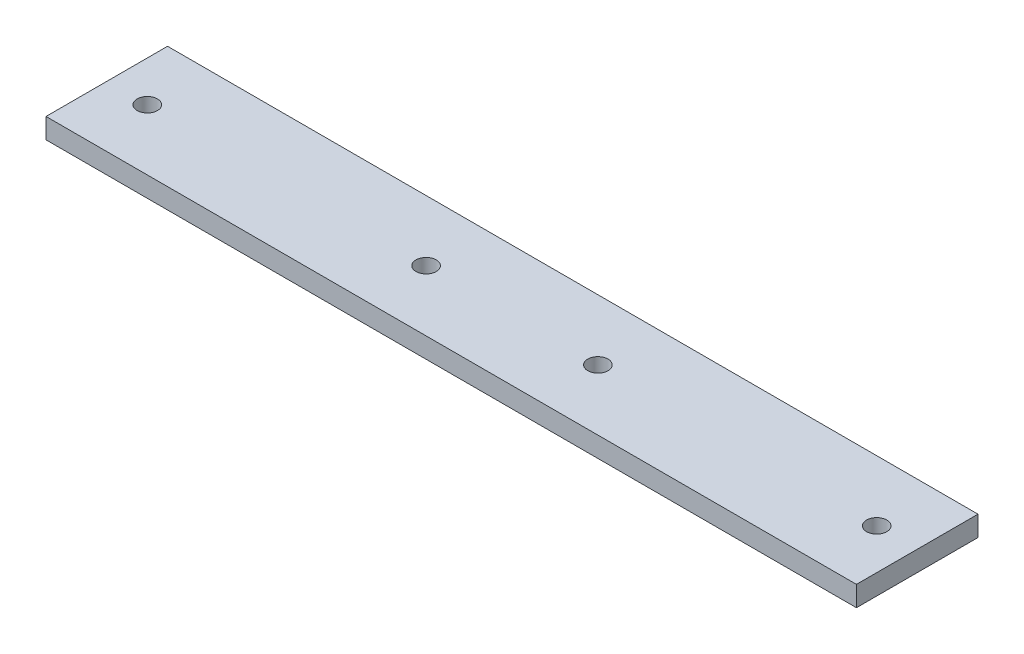
ISO-10303-21;
HEADER;
FILE_DESCRIPTION(('STEP AP214'),'2;1');
FILE_NAME('part.step','',(''),(''),'','','');
FILE_SCHEMA(('AUTOMOTIVE_DESIGN { 1 0 10303 214 1 1 1 1 }'));
ENDSEC;
DATA;
#1=APPLICATION_CONTEXT('core data for automotive mechanical design processes');
#2=APPLICATION_PROTOCOL_DEFINITION('international standard','automotive_design',2000,#1);
#3=PRODUCT_CONTEXT('',#1,'mechanical');
#4=PRODUCT('Part','Part','',(#3));
#5=PRODUCT_RELATED_PRODUCT_CATEGORY('part','',(#4));
#6=PRODUCT_DEFINITION_FORMATION('','',#4);
#7=PRODUCT_DEFINITION_CONTEXT('part definition',#1,'design');
#8=PRODUCT_DEFINITION('design','',#6,#7);
#9=PRODUCT_DEFINITION_SHAPE('','',#8);
#10=(LENGTH_UNIT() NAMED_UNIT(*) SI_UNIT(.MILLI.,.METRE.));
#11=(NAMED_UNIT(*) PLANE_ANGLE_UNIT() SI_UNIT($,.RADIAN.));
#12=(NAMED_UNIT(*) SI_UNIT($,.STERADIAN.) SOLID_ANGLE_UNIT());
#13=UNCERTAINTY_MEASURE_WITH_UNIT(LENGTH_MEASURE(1.E-05),#10,'distance_accuracy_value','');
#14=(GEOMETRIC_REPRESENTATION_CONTEXT(3) GLOBAL_UNCERTAINTY_ASSIGNED_CONTEXT((#13)) GLOBAL_UNIT_ASSIGNED_CONTEXT((#10,
#11,#12)) REPRESENTATION_CONTEXT('',''));
#15=CARTESIAN_POINT('',(0.,0.,0.));
#16=DIRECTION('',(0.,0.,1.));
#17=DIRECTION('',(1.,0.,0.));
#18=AXIS2_PLACEMENT_3D('',#15,#16,#17);
#19=CARTESIAN_POINT('',(0.,5.,0.));
#20=DIRECTION('',(0.,1.,0.));
#21=DIRECTION('',(0.,0.,1.));
#22=AXIS2_PLACEMENT_3D('',#19,#20,#21);
#23=PLANE('',#22);
#24=CARTESIAN_POINT('',(107.2,5.,7.91666666666667));
#25=DIRECTION('',(0.,1.,0.));
#26=DIRECTION('',(0.,0.,1.));
#27=AXIS2_PLACEMENT_3D('',#24,#25,#26);
#28=CIRCLE('',#27,2.5);
#29=CARTESIAN_POINT('',(107.2,5.,10.4166666666667));
#30=VERTEX_POINT('',#29);
#31=EDGE_CURVE('E121',#30,#30,#28,.T.);
#32=ORIENTED_EDGE('',*,*,#31,.F.);
#33=EDGE_LOOP('',(#32));
#34=FACE_BOUND('',#33,.T.);
#35=CARTESIAN_POINT('',(176.,5.,7.91666666666667));
#36=DIRECTION('',(0.,1.,0.));
#37=DIRECTION('',(0.,0.,1.));
#38=AXIS2_PLACEMENT_3D('',#35,#36,#37);
#39=CIRCLE('',#38,2.5);
#40=CARTESIAN_POINT('',(176.,5.,10.4166666666667));
#41=VERTEX_POINT('',#40);
#42=EDGE_CURVE('E100',#41,#41,#39,.T.);
#43=ORIENTED_EDGE('',*,*,#42,.F.);
#44=EDGE_LOOP('',(#43));
#45=FACE_BOUND('',#44,.T.);
#46=DIRECTION('',(0.,0.,1.));
#47=VECTOR('',#46,1.);
#48=CARTESIAN_POINT('',(-14.,5.,-7.08333333333333));
#49=LINE('',#48,#47);
#50=CARTESIAN_POINT('',(-14.,5.,-7.08333333333333));
#51=VERTEX_POINT('',#50);
#52=CARTESIAN_POINT('',(-14.,5.,22.9166666666667));
#53=VERTEX_POINT('',#52);
#54=EDGE_CURVE('E85',#51,#53,#49,.T.);
#55=ORIENTED_EDGE('',*,*,#54,.T.);
#56=DIRECTION('',(1.,0.,0.));
#57=VECTOR('',#56,1.);
#58=CARTESIAN_POINT('',(-14.,5.,22.9166666666667));
#59=LINE('',#58,#57);
#60=CARTESIAN_POINT('',(186.,5.,22.9166666666667));
#61=VERTEX_POINT('',#60);
#62=EDGE_CURVE('E80',#53,#61,#59,.T.);
#63=ORIENTED_EDGE('',*,*,#62,.T.);
#64=DIRECTION('',(0.,0.,-1.));
#65=VECTOR('',#64,1.);
#66=CARTESIAN_POINT('',(186.,5.,-7.08333333333333));
#67=LINE('',#66,#65);
#68=CARTESIAN_POINT('',(186.,5.,-7.08333333333333));
#69=VERTEX_POINT('',#68);
#70=EDGE_CURVE('E83',#61,#69,#67,.T.);
#71=ORIENTED_EDGE('',*,*,#70,.T.);
#72=DIRECTION('',(-1.,0.,0.));
#73=VECTOR('',#72,1.);
#74=CARTESIAN_POINT('',(-14.,5.,-7.08333333333333));
#75=LINE('',#74,#73);
#76=EDGE_CURVE('E50',#69,#51,#75,.T.);
#77=ORIENTED_EDGE('',*,*,#76,.T.);
#78=EDGE_LOOP('',(#55,#63,#71,#77));
#79=FACE_BOUND('',#78,.T.);
#80=CARTESIAN_POINT('',(-4.00000000000002,5.,7.91666666666667));
#81=DIRECTION('',(0.,1.,0.));
#82=DIRECTION('',(0.,0.,-1.));
#83=AXIS2_PLACEMENT_3D('',#80,#81,#82);
#84=CIRCLE('',#83,2.50000000000001);
#85=CARTESIAN_POINT('',(-4.00000000000002,5.,5.41666666666666));
#86=VERTEX_POINT('',#85);
#87=EDGE_CURVE('E115',#86,#86,#84,.T.);
#88=ORIENTED_EDGE('',*,*,#87,.F.);
#89=EDGE_LOOP('',(#88));
#90=FACE_BOUND('',#89,.T.);
#91=CARTESIAN_POINT('',(64.8,5.,7.91666666666667));
#92=DIRECTION('',(0.,1.,0.));
#93=DIRECTION('',(0.,0.,-1.));
#94=AXIS2_PLACEMENT_3D('',#91,#92,#93);
#95=CIRCLE('',#94,2.5);
#96=CARTESIAN_POINT('',(64.8,5.,5.41666666666667));
#97=VERTEX_POINT('',#96);
#98=EDGE_CURVE('E127',#97,#97,#95,.T.);
#99=ORIENTED_EDGE('',*,*,#98,.F.);
#100=EDGE_LOOP('',(#99));
#101=FACE_BOUND('',#100,.T.);
#102=ADVANCED_FACE('F33',(#34,#45,#79,#90,#101),#23,.T.);
#103=CARTESIAN_POINT('',(0.,0.,0.));
#104=DIRECTION('',(0.,1.,0.));
#105=DIRECTION('',(0.,0.,1.));
#106=AXIS2_PLACEMENT_3D('',#103,#104,#105);
#107=PLANE('',#106);
#108=DIRECTION('',(0.,0.,1.));
#109=VECTOR('',#108,1.);
#110=CARTESIAN_POINT('',(-14.,0.,-7.08333333333333));
#111=LINE('',#110,#109);
#112=CARTESIAN_POINT('',(-14.,0.,-7.08333333333333));
#113=VERTEX_POINT('',#112);
#114=CARTESIAN_POINT('',(-14.,0.,22.9166666666667));
#115=VERTEX_POINT('',#114);
#116=EDGE_CURVE('E97',#113,#115,#111,.T.);
#117=ORIENTED_EDGE('',*,*,#116,.F.);
#118=DIRECTION('',(-1.,0.,0.));
#119=VECTOR('',#118,1.);
#120=CARTESIAN_POINT('',(-14.,0.,-7.08333333333333));
#121=LINE('',#120,#119);
#122=CARTESIAN_POINT('',(186.,0.,-7.08333333333333));
#123=VERTEX_POINT('',#122);
#124=EDGE_CURVE('E73',#123,#113,#121,.T.);
#125=ORIENTED_EDGE('',*,*,#124,.F.);
#126=DIRECTION('',(0.,0.,-1.));
#127=VECTOR('',#126,1.);
#128=CARTESIAN_POINT('',(186.,0.,-7.08333333333333));
#129=LINE('',#128,#127);
#130=CARTESIAN_POINT('',(186.,0.,22.9166666666667));
#131=VERTEX_POINT('',#130);
#132=EDGE_CURVE('E67',#131,#123,#129,.T.);
#133=ORIENTED_EDGE('',*,*,#132,.F.);
#134=DIRECTION('',(1.,0.,0.));
#135=VECTOR('',#134,1.);
#136=CARTESIAN_POINT('',(-14.,0.,22.9166666666667));
#137=LINE('',#136,#135);
#138=EDGE_CURVE('E89',#115,#131,#137,.T.);
#139=ORIENTED_EDGE('',*,*,#138,.F.);
#140=EDGE_LOOP('',(#117,#125,#133,#139));
#141=FACE_BOUND('',#140,.T.);
#142=CARTESIAN_POINT('',(176.,0.,7.91666666666667));
#143=DIRECTION('',(0.,1.,0.));
#144=DIRECTION('',(0.,0.,1.));
#145=AXIS2_PLACEMENT_3D('',#142,#143,#144);
#146=CIRCLE('',#145,2.5);
#147=CARTESIAN_POINT('',(176.,0.,10.4166666666667));
#148=VERTEX_POINT('',#147);
#149=EDGE_CURVE('E112',#148,#148,#146,.T.);
#150=ORIENTED_EDGE('',*,*,#149,.T.);
#151=EDGE_LOOP('',(#150));
#152=FACE_BOUND('',#151,.T.);
#153=CARTESIAN_POINT('',(-4.00000000000002,0.,7.91666666666667));
#154=DIRECTION('',(0.,1.,0.));
#155=DIRECTION('',(0.,0.,-1.));
#156=AXIS2_PLACEMENT_3D('',#153,#154,#155);
#157=CIRCLE('',#156,2.50000000000001);
#158=CARTESIAN_POINT('',(-4.00000000000002,0.,5.41666666666666));
#159=VERTEX_POINT('',#158);
#160=EDGE_CURVE('E118',#159,#159,#157,.T.);
#161=ORIENTED_EDGE('',*,*,#160,.T.);
#162=EDGE_LOOP('',(#161));
#163=FACE_BOUND('',#162,.T.);
#164=CARTESIAN_POINT('',(107.2,0.,7.91666666666667));
#165=DIRECTION('',(0.,1.,0.));
#166=DIRECTION('',(0.,0.,1.));
#167=AXIS2_PLACEMENT_3D('',#164,#165,#166);
#168=CIRCLE('',#167,2.5);
#169=CARTESIAN_POINT('',(107.2,0.,10.4166666666667));
#170=VERTEX_POINT('',#169);
#171=EDGE_CURVE('E124',#170,#170,#168,.T.);
#172=ORIENTED_EDGE('',*,*,#171,.T.);
#173=EDGE_LOOP('',(#172));
#174=FACE_BOUND('',#173,.T.);
#175=CARTESIAN_POINT('',(64.8,0.,7.91666666666667));
#176=DIRECTION('',(0.,1.,0.));
#177=DIRECTION('',(0.,0.,-1.));
#178=AXIS2_PLACEMENT_3D('',#175,#176,#177);
#179=CIRCLE('',#178,2.5);
#180=CARTESIAN_POINT('',(64.8,0.,5.41666666666667));
#181=VERTEX_POINT('',#180);
#182=EDGE_CURVE('E130',#181,#181,#179,.T.);
#183=ORIENTED_EDGE('',*,*,#182,.T.);
#184=EDGE_LOOP('',(#183));
#185=FACE_BOUND('',#184,.T.);
#186=ADVANCED_FACE('F108',(#141,#152,#163,#174,#185),#107,.F.);
#187=CARTESIAN_POINT('',(-14.,5.,-7.08333333333333));
#188=DIRECTION('',(1.,0.,0.));
#189=DIRECTION('',(0.,0.,-1.));
#190=AXIS2_PLACEMENT_3D('',#187,#188,#189);
#191=PLANE('',#190);
#192=ORIENTED_EDGE('',*,*,#116,.T.);
#193=DIRECTION('',(0.,-1.,0.));
#194=VECTOR('',#193,1.);
#195=CARTESIAN_POINT('',(-14.,5.,22.9166666666667));
#196=LINE('',#195,#194);
#197=EDGE_CURVE('E11',#53,#115,#196,.T.);
#198=ORIENTED_EDGE('',*,*,#197,.F.);
#199=ORIENTED_EDGE('',*,*,#54,.F.);
#200=DIRECTION('',(0.,-1.,0.));
#201=VECTOR('',#200,1.);
#202=CARTESIAN_POINT('',(-14.,5.,-7.08333333333333));
#203=LINE('',#202,#201);
#204=EDGE_CURVE('E93',#51,#113,#203,.T.);
#205=ORIENTED_EDGE('',*,*,#204,.T.);
#206=EDGE_LOOP('',(#192,#198,#199,#205));
#207=FACE_BOUND('',#206,.T.);
#208=ADVANCED_FACE('F35',(#207),#191,.F.);
#209=CARTESIAN_POINT('',(-14.,5.,22.9166666666667));
#210=DIRECTION('',(0.,0.,-1.));
#211=DIRECTION('',(-1.,0.,0.));
#212=AXIS2_PLACEMENT_3D('',#209,#210,#211);
#213=PLANE('',#212);
#214=ORIENTED_EDGE('',*,*,#138,.T.);
#215=DIRECTION('',(0.,-1.,0.));
#216=VECTOR('',#215,1.);
#217=CARTESIAN_POINT('',(186.,5.,22.9166666666667));
#218=LINE('',#217,#216);
#219=EDGE_CURVE('E42',#61,#131,#218,.T.);
#220=ORIENTED_EDGE('',*,*,#219,.F.);
#221=ORIENTED_EDGE('',*,*,#62,.F.);
#222=ORIENTED_EDGE('',*,*,#197,.T.);
#223=EDGE_LOOP('',(#214,#220,#221,#222));
#224=FACE_BOUND('',#223,.T.);
#225=ADVANCED_FACE('F88',(#224),#213,.F.);
#226=CARTESIAN_POINT('',(186.,5.,-7.08333333333333));
#227=DIRECTION('',(-1.,0.,0.));
#228=DIRECTION('',(0.,0.,1.));
#229=AXIS2_PLACEMENT_3D('',#226,#227,#228);
#230=PLANE('',#229);
#231=ORIENTED_EDGE('',*,*,#132,.T.);
#232=DIRECTION('',(0.,-1.,0.));
#233=VECTOR('',#232,1.);
#234=CARTESIAN_POINT('',(186.,5.,-7.08333333333333));
#235=LINE('',#234,#233);
#236=EDGE_CURVE('E90',#69,#123,#235,.T.);
#237=ORIENTED_EDGE('',*,*,#236,.F.);
#238=ORIENTED_EDGE('',*,*,#70,.F.);
#239=ORIENTED_EDGE('',*,*,#219,.T.);
#240=EDGE_LOOP('',(#231,#237,#238,#239));
#241=FACE_BOUND('',#240,.T.);
#242=ADVANCED_FACE('F91',(#241),#230,.F.);
#243=CARTESIAN_POINT('',(-14.,5.,-7.08333333333333));
#244=DIRECTION('',(0.,0.,1.));
#245=DIRECTION('',(1.,0.,0.));
#246=AXIS2_PLACEMENT_3D('',#243,#244,#245);
#247=PLANE('',#246);
#248=ORIENTED_EDGE('',*,*,#124,.T.);
#249=ORIENTED_EDGE('',*,*,#204,.F.);
#250=ORIENTED_EDGE('',*,*,#76,.F.);
#251=ORIENTED_EDGE('',*,*,#236,.T.);
#252=EDGE_LOOP('',(#248,#249,#250,#251));
#253=FACE_BOUND('',#252,.T.);
#254=ADVANCED_FACE('F105',(#253),#247,.F.);
#255=CARTESIAN_POINT('',(176.,5.,7.91666666666667));
#256=DIRECTION('',(0.,-1.,0.));
#257=DIRECTION('',(0.,0.,-1.));
#258=AXIS2_PLACEMENT_3D('',#255,#256,#257);
#259=CYLINDRICAL_SURFACE('',#258,2.5);
#260=ORIENTED_EDGE('',*,*,#42,.T.);
#261=EDGE_LOOP('',(#260));
#262=FACE_BOUND('',#261,.T.);
#263=ORIENTED_EDGE('',*,*,#149,.F.);
#264=EDGE_LOOP('',(#263));
#265=FACE_BOUND('',#264,.T.);
#266=ADVANCED_FACE('F149',(#262,#265),#259,.F.);
#267=CARTESIAN_POINT('',(-4.00000000000002,5.,7.91666666666667));
#268=DIRECTION('',(0.,-1.,0.));
#269=DIRECTION('',(0.,0.,-1.));
#270=AXIS2_PLACEMENT_3D('',#267,#268,#269);
#271=CYLINDRICAL_SURFACE('',#270,2.50000000000001);
#272=ORIENTED_EDGE('',*,*,#87,.T.);
#273=EDGE_LOOP('',(#272));
#274=FACE_BOUND('',#273,.T.);
#275=ORIENTED_EDGE('',*,*,#160,.F.);
#276=EDGE_LOOP('',(#275));
#277=FACE_BOUND('',#276,.T.);
#278=ADVANCED_FACE('F195',(#274,#277),#271,.F.);
#279=CARTESIAN_POINT('',(107.2,5.,7.91666666666667));
#280=DIRECTION('',(0.,-1.,0.));
#281=DIRECTION('',(0.,0.,-1.));
#282=AXIS2_PLACEMENT_3D('',#279,#280,#281);
#283=CYLINDRICAL_SURFACE('',#282,2.5);
#284=ORIENTED_EDGE('',*,*,#31,.T.);
#285=EDGE_LOOP('',(#284));
#286=FACE_BOUND('',#285,.T.);
#287=ORIENTED_EDGE('',*,*,#171,.F.);
#288=EDGE_LOOP('',(#287));
#289=FACE_BOUND('',#288,.T.);
#290=ADVANCED_FACE('F203',(#286,#289),#283,.F.);
#291=CARTESIAN_POINT('',(64.8,5.,7.91666666666667));
#292=DIRECTION('',(0.,-1.,0.));
#293=DIRECTION('',(0.,0.,-1.));
#294=AXIS2_PLACEMENT_3D('',#291,#292,#293);
#295=CYLINDRICAL_SURFACE('',#294,2.5);
#296=ORIENTED_EDGE('',*,*,#98,.T.);
#297=EDGE_LOOP('',(#296));
#298=FACE_BOUND('',#297,.T.);
#299=ORIENTED_EDGE('',*,*,#182,.F.);
#300=EDGE_LOOP('',(#299));
#301=FACE_BOUND('',#300,.T.);
#302=ADVANCED_FACE('F136',(#298,#301),#295,.F.);
#303=CLOSED_SHELL('',(#102,#186,#208,#225,#242,#254,#266,#278,#290,#302));
#304=MANIFOLD_SOLID_BREP('B2',#303);
#305=ADVANCED_BREP_SHAPE_REPRESENTATION('',(#18,#304),#14);
#306=SHAPE_DEFINITION_REPRESENTATION(#9,#305);
ENDSEC;
END-ISO-10303-21;
